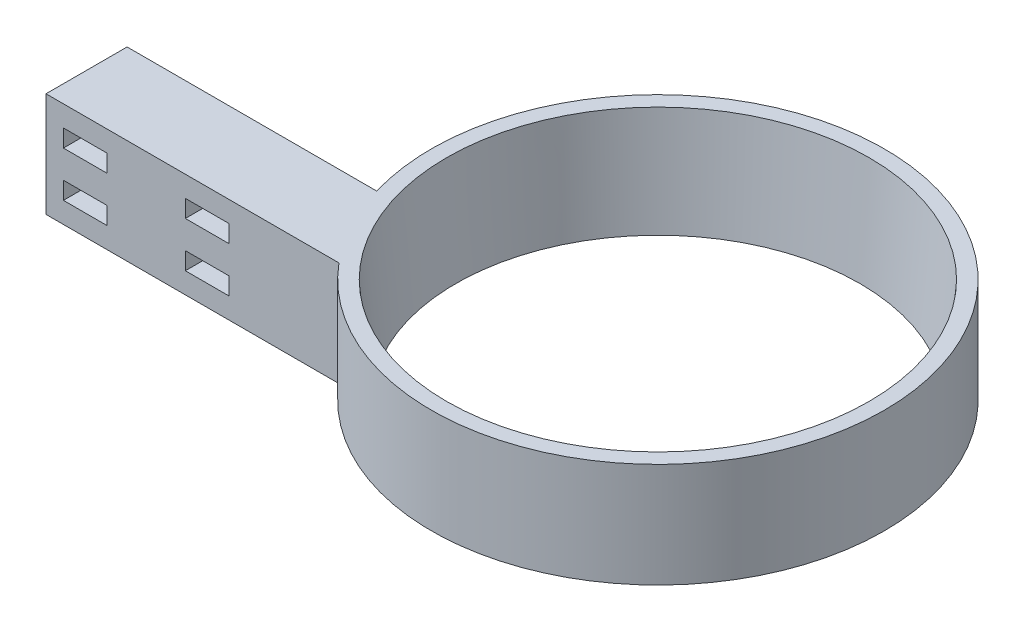
ISO-10303-21;
HEADER;
FILE_DESCRIPTION(('STEP AP214'),'2;1');
FILE_NAME('part.step','',(''),(''),'','','');
FILE_SCHEMA(('AUTOMOTIVE_DESIGN { 1 0 10303 214 1 1 1 1 }'));
ENDSEC;
DATA;
#1=APPLICATION_CONTEXT('core data for automotive mechanical design processes');
#2=APPLICATION_PROTOCOL_DEFINITION('international standard','automotive_design',2000,#1);
#3=PRODUCT_CONTEXT('',#1,'mechanical');
#4=PRODUCT('Part','Part','',(#3));
#5=PRODUCT_RELATED_PRODUCT_CATEGORY('part','',(#4));
#6=PRODUCT_DEFINITION_FORMATION('','',#4);
#7=PRODUCT_DEFINITION_CONTEXT('part definition',#1,'design');
#8=PRODUCT_DEFINITION('design','',#6,#7);
#9=PRODUCT_DEFINITION_SHAPE('','',#8);
#10=(LENGTH_UNIT() NAMED_UNIT(*) SI_UNIT(.MILLI.,.METRE.));
#11=(NAMED_UNIT(*) PLANE_ANGLE_UNIT() SI_UNIT($,.RADIAN.));
#12=(NAMED_UNIT(*) SI_UNIT($,.STERADIAN.) SOLID_ANGLE_UNIT());
#13=UNCERTAINTY_MEASURE_WITH_UNIT(LENGTH_MEASURE(1.E-05),#10,'distance_accuracy_value','');
#14=(GEOMETRIC_REPRESENTATION_CONTEXT(3) GLOBAL_UNCERTAINTY_ASSIGNED_CONTEXT((#13)) GLOBAL_UNIT_ASSIGNED_CONTEXT((#10,
#11,#12)) REPRESENTATION_CONTEXT('',''));
#15=CARTESIAN_POINT('',(0.,0.,0.));
#16=DIRECTION('',(0.,0.,1.));
#17=DIRECTION('',(1.,0.,0.));
#18=AXIS2_PLACEMENT_3D('',#15,#16,#17);
#19=CARTESIAN_POINT('',(-31.6935007697162,3.175,26.4414));
#20=DIRECTION('',(0.,0.,1.));
#21=DIRECTION('',(1.,0.,0.));
#22=AXIS2_PLACEMENT_3D('',#19,#20,#21);
#23=PLANE('',#22);
#24=DIRECTION('',(0.,1.,0.));
#25=VECTOR('',#24,1.);
#26=CARTESIAN_POINT('',(-51.7525,15.24,26.4414));
#27=LINE('',#26,#25);
#28=CARTESIAN_POINT('',(-51.7525,12.065,26.4414));
#29=VERTEX_POINT('',#28);
#30=CARTESIAN_POINT('',(-51.7525,15.24,26.4414));
#31=VERTEX_POINT('',#30);
#32=EDGE_CURVE('E252',#29,#31,#27,.T.);
#33=ORIENTED_EDGE('',*,*,#32,.F.);
#34=DIRECTION('',(1.,0.,0.));
#35=VECTOR('',#34,1.);
#36=CARTESIAN_POINT('',(-59.69,12.065,26.4414));
#37=LINE('',#36,#35);
#38=CARTESIAN_POINT('',(-59.69,12.065,26.4414));
#39=VERTEX_POINT('',#38);
#40=EDGE_CURVE('E260',#39,#29,#37,.T.);
#41=ORIENTED_EDGE('',*,*,#40,.F.);
#42=DIRECTION('',(0.,-1.,0.));
#43=VECTOR('',#42,1.);
#44=CARTESIAN_POINT('',(-59.69,15.24,26.4414));
#45=LINE('',#44,#43);
#46=CARTESIAN_POINT('',(-59.69,15.24,26.4414));
#47=VERTEX_POINT('',#46);
#48=EDGE_CURVE('E257',#47,#39,#45,.T.);
#49=ORIENTED_EDGE('',*,*,#48,.F.);
#50=DIRECTION('',(-1.,0.,0.));
#51=VECTOR('',#50,1.);
#52=CARTESIAN_POINT('',(-59.69,15.24,26.4414));
#53=LINE('',#52,#51);
#54=EDGE_CURVE('E254',#31,#47,#53,.T.);
#55=ORIENTED_EDGE('',*,*,#54,.F.);
#56=EDGE_LOOP('',(#33,#41,#49,#55));
#57=FACE_BOUND('',#56,.T.);
#58=DIRECTION('',(0.,1.,0.));
#59=VECTOR('',#58,1.);
#60=CARTESIAN_POINT('',(-73.9775,15.24,26.4414));
#61=LINE('',#60,#59);
#62=CARTESIAN_POINT('',(-73.9775,12.065,26.4414));
#63=VERTEX_POINT('',#62);
#64=CARTESIAN_POINT('',(-73.9775,15.24,26.4414));
#65=VERTEX_POINT('',#64);
#66=EDGE_CURVE('E284',#63,#65,#61,.T.);
#67=ORIENTED_EDGE('',*,*,#66,.F.);
#68=DIRECTION('',(1.,0.,0.));
#69=VECTOR('',#68,1.);
#70=CARTESIAN_POINT('',(-81.915,12.065,26.4414));
#71=LINE('',#70,#69);
#72=CARTESIAN_POINT('',(-81.915,12.065,26.4414));
#73=VERTEX_POINT('',#72);
#74=EDGE_CURVE('E292',#73,#63,#71,.T.);
#75=ORIENTED_EDGE('',*,*,#74,.F.);
#76=DIRECTION('',(0.,-1.,0.));
#77=VECTOR('',#76,1.);
#78=CARTESIAN_POINT('',(-81.915,15.24,26.4414));
#79=LINE('',#78,#77);
#80=CARTESIAN_POINT('',(-81.915,15.24,26.4414));
#81=VERTEX_POINT('',#80);
#82=EDGE_CURVE('E289',#81,#73,#79,.T.);
#83=ORIENTED_EDGE('',*,*,#82,.F.);
#84=DIRECTION('',(-1.,0.,0.));
#85=VECTOR('',#84,1.);
#86=CARTESIAN_POINT('',(-81.915,15.24,26.4414));
#87=LINE('',#86,#85);
#88=EDGE_CURVE('E286',#65,#81,#87,.T.);
#89=ORIENTED_EDGE('',*,*,#88,.F.);
#90=EDGE_LOOP('',(#67,#75,#83,#89));
#91=FACE_BOUND('',#90,.T.);
#92=DIRECTION('',(-1.,0.,0.));
#93=VECTOR('',#92,1.);
#94=CARTESIAN_POINT('',(-31.6935007697162,0.,26.4414));
#95=LINE('',#94,#93);
#96=CARTESIAN_POINT('',(-31.6935007697162,0.,26.4414));
#97=VERTEX_POINT('',#96);
#98=CARTESIAN_POINT('',(-85.09,0.,26.4414));
#99=VERTEX_POINT('',#98);
#100=EDGE_CURVE('E328',#97,#99,#95,.T.);
#101=ORIENTED_EDGE('',*,*,#100,.F.);
#102=DIRECTION('',(0.,-1.,0.));
#103=VECTOR('',#102,1.);
#104=CARTESIAN_POINT('',(-31.6935007697162,3.175,26.4414));
#105=LINE('',#104,#103);
#106=CARTESIAN_POINT('',(-31.6935007697162,19.05,26.4414));
#107=VERTEX_POINT('',#106);
#108=EDGE_CURVE('E334',#107,#97,#105,.T.);
#109=ORIENTED_EDGE('',*,*,#108,.F.);
#110=DIRECTION('',(-1.,0.,0.));
#111=VECTOR('',#110,1.);
#112=CARTESIAN_POINT('',(-85.09,19.05,26.4414));
#113=LINE('',#112,#111);
#114=CARTESIAN_POINT('',(-85.09,19.05,26.4414));
#115=VERTEX_POINT('',#114);
#116=EDGE_CURVE('E316',#107,#115,#113,.T.);
#117=ORIENTED_EDGE('',*,*,#116,.T.);
#118=DIRECTION('',(0.,-1.,0.));
#119=VECTOR('',#118,1.);
#120=CARTESIAN_POINT('',(-85.09,3.175,26.4414));
#121=LINE('',#120,#119);
#122=EDGE_CURVE('E332',#115,#99,#121,.T.);
#123=ORIENTED_EDGE('',*,*,#122,.T.);
#124=EDGE_LOOP('',(#101,#109,#117,#123));
#125=FACE_BOUND('',#124,.T.);
#126=DIRECTION('',(1.,0.,0.));
#127=VECTOR('',#126,1.);
#128=CARTESIAN_POINT('',(-59.69,6.985,26.4414));
#129=LINE('',#128,#127);
#130=CARTESIAN_POINT('',(-59.69,6.985,26.4414));
#131=VERTEX_POINT('',#130);
#132=CARTESIAN_POINT('',(-51.7525,6.985,26.4414));
#133=VERTEX_POINT('',#132);
#134=EDGE_CURVE('E224',#131,#133,#129,.T.);
#135=ORIENTED_EDGE('',*,*,#134,.T.);
#136=DIRECTION('',(0.,-1.,0.));
#137=VECTOR('',#136,1.);
#138=CARTESIAN_POINT('',(-51.7525,3.81,26.4414));
#139=LINE('',#138,#137);
#140=CARTESIAN_POINT('',(-51.7525,3.81,26.4414));
#141=VERTEX_POINT('',#140);
#142=EDGE_CURVE('E62',#133,#141,#139,.T.);
#143=ORIENTED_EDGE('',*,*,#142,.T.);
#144=DIRECTION('',(-1.,0.,0.));
#145=VECTOR('',#144,1.);
#146=CARTESIAN_POINT('',(-59.69,3.81,26.4414));
#147=LINE('',#146,#145);
#148=CARTESIAN_POINT('',(-59.69,3.81,26.4414));
#149=VERTEX_POINT('',#148);
#150=EDGE_CURVE('E230',#141,#149,#147,.T.);
#151=ORIENTED_EDGE('',*,*,#150,.T.);
#152=DIRECTION('',(0.,1.,0.));
#153=VECTOR('',#152,1.);
#154=CARTESIAN_POINT('',(-59.69,3.81,26.4414));
#155=LINE('',#154,#153);
#156=EDGE_CURVE('E227',#149,#131,#155,.T.);
#157=ORIENTED_EDGE('',*,*,#156,.T.);
#158=EDGE_LOOP('',(#135,#143,#151,#157));
#159=FACE_BOUND('',#158,.T.);
#160=DIRECTION('',(1.,0.,0.));
#161=VECTOR('',#160,1.);
#162=CARTESIAN_POINT('',(-81.915,6.985,26.4414));
#163=LINE('',#162,#161);
#164=CARTESIAN_POINT('',(-81.915,6.985,26.4414));
#165=VERTEX_POINT('',#164);
#166=CARTESIAN_POINT('',(-73.9775,6.985,26.4414));
#167=VERTEX_POINT('',#166);
#168=EDGE_CURVE('E199',#165,#167,#163,.T.);
#169=ORIENTED_EDGE('',*,*,#168,.T.);
#170=DIRECTION('',(0.,-1.,0.));
#171=VECTOR('',#170,1.);
#172=CARTESIAN_POINT('',(-73.9775,3.81,26.4414));
#173=LINE('',#172,#171);
#174=CARTESIAN_POINT('',(-73.9775,3.81,26.4414));
#175=VERTEX_POINT('',#174);
#176=EDGE_CURVE('E54',#167,#175,#173,.T.);
#177=ORIENTED_EDGE('',*,*,#176,.T.);
#178=DIRECTION('',(-1.,0.,0.));
#179=VECTOR('',#178,1.);
#180=CARTESIAN_POINT('',(-81.915,3.81,26.4414));
#181=LINE('',#180,#179);
#182=CARTESIAN_POINT('',(-81.915,3.81,26.4414));
#183=VERTEX_POINT('',#182);
#184=EDGE_CURVE('E184',#175,#183,#181,.T.);
#185=ORIENTED_EDGE('',*,*,#184,.T.);
#186=DIRECTION('',(0.,1.,0.));
#187=VECTOR('',#186,1.);
#188=CARTESIAN_POINT('',(-81.915,3.81,26.4414));
#189=LINE('',#188,#187);
#190=EDGE_CURVE('E206',#183,#165,#189,.T.);
#191=ORIENTED_EDGE('',*,*,#190,.T.);
#192=EDGE_LOOP('',(#169,#177,#185,#191));
#193=FACE_BOUND('',#192,.T.);
#194=ADVANCED_FACE('F39',(#57,#91,#125,#159,#193),#23,.T.);
#195=CARTESIAN_POINT('',(-85.09,3.175,11.6586));
#196=DIRECTION('',(0.,0.,-1.));
#197=DIRECTION('',(-1.,0.,0.));
#198=AXIS2_PLACEMENT_3D('',#195,#196,#197);
#199=PLANE('',#198);
#200=DIRECTION('',(0.,1.,0.));
#201=VECTOR('',#200,1.);
#202=CARTESIAN_POINT('',(-51.7525,15.24,11.6586));
#203=LINE('',#202,#201);
#204=CARTESIAN_POINT('',(-51.7525,12.065,11.6586));
#205=VERTEX_POINT('',#204);
#206=CARTESIAN_POINT('',(-51.7525,15.24,11.6586));
#207=VERTEX_POINT('',#206);
#208=EDGE_CURVE('E249',#205,#207,#203,.T.);
#209=ORIENTED_EDGE('',*,*,#208,.T.);
#210=DIRECTION('',(-1.,0.,0.));
#211=VECTOR('',#210,1.);
#212=CARTESIAN_POINT('',(-59.69,15.24,11.6586));
#213=LINE('',#212,#211);
#214=CARTESIAN_POINT('',(-59.69,15.24,11.6586));
#215=VERTEX_POINT('',#214);
#216=EDGE_CURVE('E266',#207,#215,#213,.T.);
#217=ORIENTED_EDGE('',*,*,#216,.T.);
#218=DIRECTION('',(0.,-1.,0.));
#219=VECTOR('',#218,1.);
#220=CARTESIAN_POINT('',(-59.69,15.24,11.6586));
#221=LINE('',#220,#219);
#222=CARTESIAN_POINT('',(-59.69,12.065,11.6586));
#223=VERTEX_POINT('',#222);
#224=EDGE_CURVE('E192',#215,#223,#221,.T.);
#225=ORIENTED_EDGE('',*,*,#224,.T.);
#226=DIRECTION('',(1.,0.,0.));
#227=VECTOR('',#226,1.);
#228=CARTESIAN_POINT('',(-59.69,12.065,11.6586));
#229=LINE('',#228,#227);
#230=EDGE_CURVE('E246',#223,#205,#229,.T.);
#231=ORIENTED_EDGE('',*,*,#230,.T.);
#232=EDGE_LOOP('',(#209,#217,#225,#231));
#233=FACE_BOUND('',#232,.T.);
#234=DIRECTION('',(0.,1.,0.));
#235=VECTOR('',#234,1.);
#236=CARTESIAN_POINT('',(-73.9775,15.24,11.6586));
#237=LINE('',#236,#235);
#238=CARTESIAN_POINT('',(-73.9775,12.065,11.6586));
#239=VERTEX_POINT('',#238);
#240=CARTESIAN_POINT('',(-73.9775,15.24,11.6586));
#241=VERTEX_POINT('',#240);
#242=EDGE_CURVE('E281',#239,#241,#237,.T.);
#243=ORIENTED_EDGE('',*,*,#242,.T.);
#244=DIRECTION('',(-1.,0.,0.));
#245=VECTOR('',#244,1.);
#246=CARTESIAN_POINT('',(-81.915,15.24,11.6586));
#247=LINE('',#246,#245);
#248=CARTESIAN_POINT('',(-81.915,15.24,11.6586));
#249=VERTEX_POINT('',#248);
#250=EDGE_CURVE('E298',#241,#249,#247,.T.);
#251=ORIENTED_EDGE('',*,*,#250,.T.);
#252=DIRECTION('',(0.,-1.,0.));
#253=VECTOR('',#252,1.);
#254=CARTESIAN_POINT('',(-81.915,15.24,11.6586));
#255=LINE('',#254,#253);
#256=CARTESIAN_POINT('',(-81.915,12.065,11.6586));
#257=VERTEX_POINT('',#256);
#258=EDGE_CURVE('E275',#249,#257,#255,.T.);
#259=ORIENTED_EDGE('',*,*,#258,.T.);
#260=DIRECTION('',(1.,0.,0.));
#261=VECTOR('',#260,1.);
#262=CARTESIAN_POINT('',(-81.915,12.065,11.6586));
#263=LINE('',#262,#261);
#264=EDGE_CURVE('E278',#257,#239,#263,.T.);
#265=ORIENTED_EDGE('',*,*,#264,.T.);
#266=EDGE_LOOP('',(#243,#251,#259,#265));
#267=FACE_BOUND('',#266,.T.);
#268=DIRECTION('',(1.,0.,0.));
#269=VECTOR('',#268,1.);
#270=CARTESIAN_POINT('',(-85.09,0.,11.6586));
#271=LINE('',#270,#269);
#272=CARTESIAN_POINT('',(-85.09,0.,11.6586));
#273=VERTEX_POINT('',#272);
#274=CARTESIAN_POINT('',(-39.5942252233833,0.,11.6586));
#275=VERTEX_POINT('',#274);
#276=EDGE_CURVE('E325',#273,#275,#271,.T.);
#277=ORIENTED_EDGE('',*,*,#276,.F.);
#278=DIRECTION('',(0.,-1.,0.));
#279=VECTOR('',#278,1.);
#280=CARTESIAN_POINT('',(-85.09,3.175,11.6586));
#281=LINE('',#280,#279);
#282=CARTESIAN_POINT('',(-85.09,19.05,11.6586));
#283=VERTEX_POINT('',#282);
#284=EDGE_CURVE('E331',#283,#273,#281,.T.);
#285=ORIENTED_EDGE('',*,*,#284,.F.);
#286=DIRECTION('',(1.,0.,0.));
#287=VECTOR('',#286,1.);
#288=CARTESIAN_POINT('',(-85.09,19.05,11.6586));
#289=LINE('',#288,#287);
#290=CARTESIAN_POINT('',(-39.5942252233833,19.05,11.6586));
#291=VERTEX_POINT('',#290);
#292=EDGE_CURVE('E313',#283,#291,#289,.T.);
#293=ORIENTED_EDGE('',*,*,#292,.T.);
#294=DIRECTION('',(0.,-1.,0.));
#295=VECTOR('',#294,1.);
#296=CARTESIAN_POINT('',(-39.5942252233833,3.175,11.6586));
#297=LINE('',#296,#295);
#298=EDGE_CURVE('E337',#291,#275,#297,.T.);
#299=ORIENTED_EDGE('',*,*,#298,.T.);
#300=EDGE_LOOP('',(#277,#285,#293,#299));
#301=FACE_BOUND('',#300,.T.);
#302=DIRECTION('',(-1.,0.,0.));
#303=VECTOR('',#302,1.);
#304=CARTESIAN_POINT('',(-59.69,3.81,11.6586));
#305=LINE('',#304,#303);
#306=CARTESIAN_POINT('',(-51.7525,3.81,11.6586));
#307=VERTEX_POINT('',#306);
#308=CARTESIAN_POINT('',(-59.69,3.81,11.6586));
#309=VERTEX_POINT('',#308);
#310=EDGE_CURVE('E217',#307,#309,#305,.T.);
#311=ORIENTED_EDGE('',*,*,#310,.F.);
#312=DIRECTION('',(0.,-1.,0.));
#313=VECTOR('',#312,1.);
#314=CARTESIAN_POINT('',(-51.7525,3.81,11.6586));
#315=LINE('',#314,#313);
#316=CARTESIAN_POINT('',(-51.7525,6.985,11.6586));
#317=VERTEX_POINT('',#316);
#318=EDGE_CURVE('E220',#317,#307,#315,.T.);
#319=ORIENTED_EDGE('',*,*,#318,.F.);
#320=DIRECTION('',(1.,0.,0.));
#321=VECTOR('',#320,1.);
#322=CARTESIAN_POINT('',(-59.69,6.985,11.6586));
#323=LINE('',#322,#321);
#324=CARTESIAN_POINT('',(-59.69,6.985,11.6586));
#325=VERTEX_POINT('',#324);
#326=EDGE_CURVE('E236',#325,#317,#323,.T.);
#327=ORIENTED_EDGE('',*,*,#326,.F.);
#328=DIRECTION('',(0.,1.,0.));
#329=VECTOR('',#328,1.);
#330=CARTESIAN_POINT('',(-59.69,3.81,11.6586));
#331=LINE('',#330,#329);
#332=EDGE_CURVE('E215',#309,#325,#331,.T.);
#333=ORIENTED_EDGE('',*,*,#332,.F.);
#334=EDGE_LOOP('',(#311,#319,#327,#333));
#335=FACE_BOUND('',#334,.T.);
#336=DIRECTION('',(-1.,0.,0.));
#337=VECTOR('',#336,1.);
#338=CARTESIAN_POINT('',(-81.915,3.81,11.6586));
#339=LINE('',#338,#337);
#340=CARTESIAN_POINT('',(-73.9775,3.81,11.6586));
#341=VERTEX_POINT('',#340);
#342=CARTESIAN_POINT('',(-81.915,3.81,11.6586));
#343=VERTEX_POINT('',#342);
#344=EDGE_CURVE('E197',#341,#343,#339,.T.);
#345=ORIENTED_EDGE('',*,*,#344,.F.);
#346=DIRECTION('',(0.,-1.,0.));
#347=VECTOR('',#346,1.);
#348=CARTESIAN_POINT('',(-73.9775,3.81,11.6586));
#349=LINE('',#348,#347);
#350=CARTESIAN_POINT('',(-73.9775,6.985,11.6586));
#351=VERTEX_POINT('',#350);
#352=EDGE_CURVE('E178',#351,#341,#349,.T.);
#353=ORIENTED_EDGE('',*,*,#352,.F.);
#354=DIRECTION('',(1.,0.,0.));
#355=VECTOR('',#354,1.);
#356=CARTESIAN_POINT('',(-81.915,6.985,11.6586));
#357=LINE('',#356,#355);
#358=CARTESIAN_POINT('',(-81.915,6.985,11.6586));
#359=VERTEX_POINT('',#358);
#360=EDGE_CURVE('E188',#359,#351,#357,.T.);
#361=ORIENTED_EDGE('',*,*,#360,.F.);
#362=DIRECTION('',(0.,1.,0.));
#363=VECTOR('',#362,1.);
#364=CARTESIAN_POINT('',(-81.915,3.81,11.6586));
#365=LINE('',#364,#363);
#366=EDGE_CURVE('E201',#343,#359,#365,.T.);
#367=ORIENTED_EDGE('',*,*,#366,.F.);
#368=EDGE_LOOP('',(#345,#353,#361,#367));
#369=FACE_BOUND('',#368,.T.);
#370=ADVANCED_FACE('F195',(#233,#267,#301,#335,#369),#199,.T.);
#371=CARTESIAN_POINT('',(0.,19.05,0.));
#372=DIRECTION('',(0.,-1.,0.));
#373=DIRECTION('',(0.,0.,-1.));
#374=AXIS2_PLACEMENT_3D('',#371,#372,#373);
#375=CYLINDRICAL_SURFACE('',#374,41.275);
#376=ORIENTED_EDGE('',*,*,#298,.F.);
#377=CARTESIAN_POINT('',(0.,19.05,0.));
#378=DIRECTION('',(0.,1.,0.));
#379=DIRECTION('',(0.,0.,1.));
#380=AXIS2_PLACEMENT_3D('',#377,#378,#379);
#381=CIRCLE('',#380,41.275);
#382=EDGE_CURVE('E11',#107,#291,#381,.T.);
#383=ORIENTED_EDGE('',*,*,#382,.F.);
#384=ORIENTED_EDGE('',*,*,#108,.T.);
#385=CARTESIAN_POINT('',(0.,0.,0.));
#386=DIRECTION('',(0.,1.,0.));
#387=DIRECTION('',(0.,0.,1.));
#388=AXIS2_PLACEMENT_3D('',#385,#386,#387);
#389=CIRCLE('',#388,41.275);
#390=EDGE_CURVE('E43',#97,#275,#389,.T.);
#391=ORIENTED_EDGE('',*,*,#390,.T.);
#392=EDGE_LOOP('',(#376,#383,#384,#391));
#393=FACE_BOUND('',#392,.T.);
#394=ADVANCED_FACE('F41',(#393),#375,.T.);
#395=CARTESIAN_POINT('',(0.,19.05,0.));
#396=DIRECTION('',(0.,1.,0.));
#397=DIRECTION('',(0.,0.,1.));
#398=AXIS2_PLACEMENT_3D('',#395,#396,#397);
#399=PLANE('',#398);
#400=CARTESIAN_POINT('',(0.,19.05,0.));
#401=DIRECTION('',(0.,-1.,0.));
#402=DIRECTION('',(0.,0.,-1.));
#403=AXIS2_PLACEMENT_3D('',#400,#401,#402);
#404=CIRCLE('',#403,38.4966590401689);
#405=CARTESIAN_POINT('',(0.,19.05,-38.4966590401689));
#406=VERTEX_POINT('',#405);
#407=EDGE_CURVE('E310',#406,#406,#404,.T.);
#408=ORIENTED_EDGE('',*,*,#407,.T.);
#409=EDGE_LOOP('',(#408));
#410=FACE_BOUND('',#409,.T.);
#411=ORIENTED_EDGE('',*,*,#382,.T.);
#412=ORIENTED_EDGE('',*,*,#292,.F.);
#413=DIRECTION('',(0.,0.,1.));
#414=VECTOR('',#413,1.);
#415=CARTESIAN_POINT('',(-85.09,19.05,23.2664));
#416=LINE('',#415,#414);
#417=EDGE_CURVE('E319',#283,#115,#416,.T.);
#418=ORIENTED_EDGE('',*,*,#417,.T.);
#419=ORIENTED_EDGE('',*,*,#116,.F.);
#420=EDGE_LOOP('',(#411,#412,#418,#419));
#421=FACE_BOUND('',#420,.T.);
#422=ADVANCED_FACE('F355',(#410,#421),#399,.T.);
#423=CARTESIAN_POINT('',(0.,0.,0.));
#424=DIRECTION('',(0.,1.,0.));
#425=DIRECTION('',(0.,0.,1.));
#426=AXIS2_PLACEMENT_3D('',#423,#424,#425);
#427=PLANE('',#426);
#428=CARTESIAN_POINT('',(0.,0.,0.));
#429=DIRECTION('',(0.,-1.,0.));
#430=DIRECTION('',(0.,0.,-1.));
#431=AXIS2_PLACEMENT_3D('',#428,#429,#430);
#432=CIRCLE('',#431,36.83);
#433=CARTESIAN_POINT('',(0.,0.,-36.83));
#434=VERTEX_POINT('',#433);
#435=EDGE_CURVE('E307',#434,#434,#432,.T.);
#436=ORIENTED_EDGE('',*,*,#435,.F.);
#437=EDGE_LOOP('',(#436));
#438=FACE_BOUND('',#437,.T.);
#439=ORIENTED_EDGE('',*,*,#390,.F.);
#440=ORIENTED_EDGE('',*,*,#100,.T.);
#441=DIRECTION('',(0.,0.,-1.));
#442=VECTOR('',#441,1.);
#443=CARTESIAN_POINT('',(-85.09,0.,26.4414));
#444=LINE('',#443,#442);
#445=EDGE_CURVE('E322',#99,#273,#444,.T.);
#446=ORIENTED_EDGE('',*,*,#445,.T.);
#447=ORIENTED_EDGE('',*,*,#276,.T.);
#448=EDGE_LOOP('',(#439,#440,#446,#447));
#449=FACE_BOUND('',#448,.T.);
#450=ADVANCED_FACE('F349',(#438,#449),#427,.F.);
#451=CARTESIAN_POINT('',(-85.09,3.175,26.4414));
#452=DIRECTION('',(-1.,0.,0.));
#453=DIRECTION('',(0.,0.,1.));
#454=AXIS2_PLACEMENT_3D('',#451,#452,#453);
#455=PLANE('',#454);
#456=ORIENTED_EDGE('',*,*,#417,.F.);
#457=ORIENTED_EDGE('',*,*,#284,.T.);
#458=ORIENTED_EDGE('',*,*,#445,.F.);
#459=ORIENTED_EDGE('',*,*,#122,.F.);
#460=EDGE_LOOP('',(#456,#457,#458,#459));
#461=FACE_BOUND('',#460,.T.);
#462=ADVANCED_FACE('F344',(#461),#455,.T.);
#463=CARTESIAN_POINT('',(0.,0.,0.));
#464=DIRECTION('',(0.,1.,0.));
#465=DIRECTION('',(0.,0.,-1.));
#466=AXIS2_PLACEMENT_3D('',#463,#464,#465);
#467=CONICAL_SURFACE('',#466,36.83,0.0872664625997167);
#468=ORIENTED_EDGE('',*,*,#407,.F.);
#469=EDGE_LOOP('',(#468));
#470=FACE_BOUND('',#469,.T.);
#471=ORIENTED_EDGE('',*,*,#435,.T.);
#472=EDGE_LOOP('',(#471));
#473=FACE_BOUND('',#472,.T.);
#474=ADVANCED_FACE('F377',(#470,#473),#467,.F.);
#475=CARTESIAN_POINT('',(-73.9775,15.24,-41.276));
#476=DIRECTION('',(1.,0.,0.));
#477=DIRECTION('',(0.,0.,-1.));
#478=AXIS2_PLACEMENT_3D('',#475,#476,#477);
#479=PLANE('',#478);
#480=DIRECTION('',(0.,0.,1.));
#481=VECTOR('',#480,1.);
#482=CARTESIAN_POINT('',(-73.9775,12.065,-41.276));
#483=LINE('',#482,#481);
#484=EDGE_CURVE('E296',#239,#63,#483,.T.);
#485=ORIENTED_EDGE('',*,*,#484,.T.);
#486=ORIENTED_EDGE('',*,*,#66,.T.);
#487=DIRECTION('',(0.,0.,1.));
#488=VECTOR('',#487,1.);
#489=CARTESIAN_POINT('',(-73.9775,15.24,-41.276));
#490=LINE('',#489,#488);
#491=EDGE_CURVE('E295',#241,#65,#490,.T.);
#492=ORIENTED_EDGE('',*,*,#491,.F.);
#493=ORIENTED_EDGE('',*,*,#242,.F.);
#494=EDGE_LOOP('',(#485,#486,#492,#493));
#495=FACE_BOUND('',#494,.T.);
#496=ADVANCED_FACE('F387',(#495),#479,.F.);
#497=CARTESIAN_POINT('',(-81.915,12.065,-41.276));
#498=DIRECTION('',(0.,-1.,0.));
#499=DIRECTION('',(0.,0.,-1.));
#500=AXIS2_PLACEMENT_3D('',#497,#498,#499);
#501=PLANE('',#500);
#502=DIRECTION('',(0.,0.,1.));
#503=VECTOR('',#502,1.);
#504=CARTESIAN_POINT('',(-81.915,12.065,-41.276));
#505=LINE('',#504,#503);
#506=EDGE_CURVE('E299',#257,#73,#505,.T.);
#507=ORIENTED_EDGE('',*,*,#506,.T.);
#508=ORIENTED_EDGE('',*,*,#74,.T.);
#509=ORIENTED_EDGE('',*,*,#484,.F.);
#510=ORIENTED_EDGE('',*,*,#264,.F.);
#511=EDGE_LOOP('',(#507,#508,#509,#510));
#512=FACE_BOUND('',#511,.T.);
#513=ADVANCED_FACE('F392',(#512),#501,.F.);
#514=CARTESIAN_POINT('',(-81.915,15.24,-41.276));
#515=DIRECTION('',(-1.,0.,0.));
#516=DIRECTION('',(0.,0.,1.));
#517=AXIS2_PLACEMENT_3D('',#514,#515,#516);
#518=PLANE('',#517);
#519=DIRECTION('',(0.,0.,1.));
#520=VECTOR('',#519,1.);
#521=CARTESIAN_POINT('',(-81.915,15.24,-41.276));
#522=LINE('',#521,#520);
#523=EDGE_CURVE('E301',#249,#81,#522,.T.);
#524=ORIENTED_EDGE('',*,*,#523,.T.);
#525=ORIENTED_EDGE('',*,*,#82,.T.);
#526=ORIENTED_EDGE('',*,*,#506,.F.);
#527=ORIENTED_EDGE('',*,*,#258,.F.);
#528=EDGE_LOOP('',(#524,#525,#526,#527));
#529=FACE_BOUND('',#528,.T.);
#530=ADVANCED_FACE('F398',(#529),#518,.F.);
#531=CARTESIAN_POINT('',(-81.915,15.24,-41.276));
#532=DIRECTION('',(0.,1.,0.));
#533=DIRECTION('',(-1.,0.,0.));
#534=AXIS2_PLACEMENT_3D('',#531,#532,#533);
#535=PLANE('',#534);
#536=ORIENTED_EDGE('',*,*,#491,.T.);
#537=ORIENTED_EDGE('',*,*,#88,.T.);
#538=ORIENTED_EDGE('',*,*,#523,.F.);
#539=ORIENTED_EDGE('',*,*,#250,.F.);
#540=EDGE_LOOP('',(#536,#537,#538,#539));
#541=FACE_BOUND('',#540,.T.);
#542=ADVANCED_FACE('F402',(#541),#535,.F.);
#543=CARTESIAN_POINT('',(-51.7525,15.24,-41.276));
#544=DIRECTION('',(1.,0.,0.));
#545=DIRECTION('',(0.,0.,-1.));
#546=AXIS2_PLACEMENT_3D('',#543,#544,#545);
#547=PLANE('',#546);
#548=DIRECTION('',(0.,0.,1.));
#549=VECTOR('',#548,1.);
#550=CARTESIAN_POINT('',(-51.7525,12.065,-41.276));
#551=LINE('',#550,#549);
#552=EDGE_CURVE('E264',#205,#29,#551,.T.);
#553=ORIENTED_EDGE('',*,*,#552,.T.);
#554=ORIENTED_EDGE('',*,*,#32,.T.);
#555=DIRECTION('',(0.,0.,1.));
#556=VECTOR('',#555,1.);
#557=CARTESIAN_POINT('',(-51.7525,15.24,-41.276));
#558=LINE('',#557,#556);
#559=EDGE_CURVE('E263',#207,#31,#558,.T.);
#560=ORIENTED_EDGE('',*,*,#559,.F.);
#561=ORIENTED_EDGE('',*,*,#208,.F.);
#562=EDGE_LOOP('',(#553,#554,#560,#561));
#563=FACE_BOUND('',#562,.T.);
#564=ADVANCED_FACE('F405',(#563),#547,.F.);
#565=CARTESIAN_POINT('',(-59.69,12.065,-41.276));
#566=DIRECTION('',(0.,-1.,0.));
#567=DIRECTION('',(0.,0.,-1.));
#568=AXIS2_PLACEMENT_3D('',#565,#566,#567);
#569=PLANE('',#568);
#570=DIRECTION('',(0.,0.,1.));
#571=VECTOR('',#570,1.);
#572=CARTESIAN_POINT('',(-59.69,12.065,-41.276));
#573=LINE('',#572,#571);
#574=EDGE_CURVE('E267',#223,#39,#573,.T.);
#575=ORIENTED_EDGE('',*,*,#574,.T.);
#576=ORIENTED_EDGE('',*,*,#40,.T.);
#577=ORIENTED_EDGE('',*,*,#552,.F.);
#578=ORIENTED_EDGE('',*,*,#230,.F.);
#579=EDGE_LOOP('',(#575,#576,#577,#578));
#580=FACE_BOUND('',#579,.T.);
#581=ADVANCED_FACE('F412',(#580),#569,.F.);
#582=CARTESIAN_POINT('',(-59.69,15.24,-41.276));
#583=DIRECTION('',(-1.,0.,0.));
#584=DIRECTION('',(0.,0.,1.));
#585=AXIS2_PLACEMENT_3D('',#582,#583,#584);
#586=PLANE('',#585);
#587=DIRECTION('',(0.,0.,1.));
#588=VECTOR('',#587,1.);
#589=CARTESIAN_POINT('',(-59.69,15.24,-41.276));
#590=LINE('',#589,#588);
#591=EDGE_CURVE('E269',#215,#47,#590,.T.);
#592=ORIENTED_EDGE('',*,*,#591,.T.);
#593=ORIENTED_EDGE('',*,*,#48,.T.);
#594=ORIENTED_EDGE('',*,*,#574,.F.);
#595=ORIENTED_EDGE('',*,*,#224,.F.);
#596=EDGE_LOOP('',(#592,#593,#594,#595));
#597=FACE_BOUND('',#596,.T.);
#598=ADVANCED_FACE('F417',(#597),#586,.F.);
#599=CARTESIAN_POINT('',(-59.69,15.24,-41.276));
#600=DIRECTION('',(0.,1.,0.));
#601=DIRECTION('',(-1.,0.,0.));
#602=AXIS2_PLACEMENT_3D('',#599,#600,#601);
#603=PLANE('',#602);
#604=ORIENTED_EDGE('',*,*,#559,.T.);
#605=ORIENTED_EDGE('',*,*,#54,.T.);
#606=ORIENTED_EDGE('',*,*,#591,.F.);
#607=ORIENTED_EDGE('',*,*,#216,.F.);
#608=EDGE_LOOP('',(#604,#605,#606,#607));
#609=FACE_BOUND('',#608,.T.);
#610=ADVANCED_FACE('F414',(#609),#603,.F.);
#611=CARTESIAN_POINT('',(-51.7525,3.81,-41.276));
#612=DIRECTION('',(-1.,0.,0.));
#613=DIRECTION('',(0.,0.,1.));
#614=AXIS2_PLACEMENT_3D('',#611,#612,#613);
#615=PLANE('',#614);
#616=ORIENTED_EDGE('',*,*,#318,.T.);
#617=DIRECTION('',(0.,0.,1.));
#618=VECTOR('',#617,1.);
#619=CARTESIAN_POINT('',(-51.7525,3.81,-41.276));
#620=LINE('',#619,#618);
#621=EDGE_CURVE('E234',#307,#141,#620,.T.);
#622=ORIENTED_EDGE('',*,*,#621,.T.);
#623=ORIENTED_EDGE('',*,*,#142,.F.);
#624=DIRECTION('',(0.,0.,1.));
#625=VECTOR('',#624,1.);
#626=CARTESIAN_POINT('',(-51.7525,6.985,-41.276));
#627=LINE('',#626,#625);
#628=EDGE_CURVE('E233',#317,#133,#627,.T.);
#629=ORIENTED_EDGE('',*,*,#628,.F.);
#630=EDGE_LOOP('',(#616,#622,#623,#629));
#631=FACE_BOUND('',#630,.T.);
#632=ADVANCED_FACE('F416',(#631),#615,.T.);
#633=CARTESIAN_POINT('',(-59.69,3.81,-41.276));
#634=DIRECTION('',(0.,1.,0.));
#635=DIRECTION('',(-1.,0.,0.));
#636=AXIS2_PLACEMENT_3D('',#633,#634,#635);
#637=PLANE('',#636);
#638=ORIENTED_EDGE('',*,*,#310,.T.);
#639=DIRECTION('',(0.,0.,1.));
#640=VECTOR('',#639,1.);
#641=CARTESIAN_POINT('',(-59.69,3.81,-41.276));
#642=LINE('',#641,#640);
#643=EDGE_CURVE('E237',#309,#149,#642,.T.);
#644=ORIENTED_EDGE('',*,*,#643,.T.);
#645=ORIENTED_EDGE('',*,*,#150,.F.);
#646=ORIENTED_EDGE('',*,*,#621,.F.);
#647=EDGE_LOOP('',(#638,#644,#645,#646));
#648=FACE_BOUND('',#647,.T.);
#649=ADVANCED_FACE('F427',(#648),#637,.T.);
#650=CARTESIAN_POINT('',(-59.69,3.81,-41.276));
#651=DIRECTION('',(1.,0.,0.));
#652=DIRECTION('',(0.,0.,-1.));
#653=AXIS2_PLACEMENT_3D('',#650,#651,#652);
#654=PLANE('',#653);
#655=ORIENTED_EDGE('',*,*,#332,.T.);
#656=DIRECTION('',(0.,0.,1.));
#657=VECTOR('',#656,1.);
#658=CARTESIAN_POINT('',(-59.69,6.985,-41.276));
#659=LINE('',#658,#657);
#660=EDGE_CURVE('E239',#325,#131,#659,.T.);
#661=ORIENTED_EDGE('',*,*,#660,.T.);
#662=ORIENTED_EDGE('',*,*,#156,.F.);
#663=ORIENTED_EDGE('',*,*,#643,.F.);
#664=EDGE_LOOP('',(#655,#661,#662,#663));
#665=FACE_BOUND('',#664,.T.);
#666=ADVANCED_FACE('F431',(#665),#654,.T.);
#667=CARTESIAN_POINT('',(-59.69,6.985,-41.276));
#668=DIRECTION('',(0.,-1.,0.));
#669=DIRECTION('',(0.,0.,-1.));
#670=AXIS2_PLACEMENT_3D('',#667,#668,#669);
#671=PLANE('',#670);
#672=ORIENTED_EDGE('',*,*,#326,.T.);
#673=ORIENTED_EDGE('',*,*,#628,.T.);
#674=ORIENTED_EDGE('',*,*,#134,.F.);
#675=ORIENTED_EDGE('',*,*,#660,.F.);
#676=EDGE_LOOP('',(#672,#673,#674,#675));
#677=FACE_BOUND('',#676,.T.);
#678=ADVANCED_FACE('F428',(#677),#671,.T.);
#679=CARTESIAN_POINT('',(-73.9775,3.81,-41.276));
#680=DIRECTION('',(-1.,0.,0.));
#681=DIRECTION('',(0.,0.,1.));
#682=AXIS2_PLACEMENT_3D('',#679,#680,#681);
#683=PLANE('',#682);
#684=ORIENTED_EDGE('',*,*,#352,.T.);
#685=DIRECTION('',(0.,0.,1.));
#686=VECTOR('',#685,1.);
#687=CARTESIAN_POINT('',(-73.9775,3.81,-41.276));
#688=LINE('',#687,#686);
#689=EDGE_CURVE('E193',#341,#175,#688,.T.);
#690=ORIENTED_EDGE('',*,*,#689,.T.);
#691=ORIENTED_EDGE('',*,*,#176,.F.);
#692=DIRECTION('',(0.,0.,1.));
#693=VECTOR('',#692,1.);
#694=CARTESIAN_POINT('',(-73.9775,6.985,-41.276));
#695=LINE('',#694,#693);
#696=EDGE_CURVE('E174',#351,#167,#695,.T.);
#697=ORIENTED_EDGE('',*,*,#696,.F.);
#698=EDGE_LOOP('',(#684,#690,#691,#697));
#699=FACE_BOUND('',#698,.T.);
#700=ADVANCED_FACE('F176',(#699),#683,.T.);
#701=CARTESIAN_POINT('',(-81.915,3.81,-41.276));
#702=DIRECTION('',(0.,1.,0.));
#703=DIRECTION('',(-1.,0.,0.));
#704=AXIS2_PLACEMENT_3D('',#701,#702,#703);
#705=PLANE('',#704);
#706=ORIENTED_EDGE('',*,*,#344,.T.);
#707=DIRECTION('',(0.,0.,1.));
#708=VECTOR('',#707,1.);
#709=CARTESIAN_POINT('',(-81.915,3.81,-41.276));
#710=LINE('',#709,#708);
#711=EDGE_CURVE('E212',#343,#183,#710,.T.);
#712=ORIENTED_EDGE('',*,*,#711,.T.);
#713=ORIENTED_EDGE('',*,*,#184,.F.);
#714=ORIENTED_EDGE('',*,*,#689,.F.);
#715=EDGE_LOOP('',(#706,#712,#713,#714));
#716=FACE_BOUND('',#715,.T.);
#717=ADVANCED_FACE('F441',(#716),#705,.T.);
#718=CARTESIAN_POINT('',(-81.915,3.81,-41.276));
#719=DIRECTION('',(1.,0.,0.));
#720=DIRECTION('',(0.,0.,-1.));
#721=AXIS2_PLACEMENT_3D('',#718,#719,#720);
#722=PLANE('',#721);
#723=ORIENTED_EDGE('',*,*,#366,.T.);
#724=DIRECTION('',(0.,0.,1.));
#725=VECTOR('',#724,1.);
#726=CARTESIAN_POINT('',(-81.915,6.985,-41.276));
#727=LINE('',#726,#725);
#728=EDGE_CURVE('E183',#359,#165,#727,.T.);
#729=ORIENTED_EDGE('',*,*,#728,.T.);
#730=ORIENTED_EDGE('',*,*,#190,.F.);
#731=ORIENTED_EDGE('',*,*,#711,.F.);
#732=EDGE_LOOP('',(#723,#729,#730,#731));
#733=FACE_BOUND('',#732,.T.);
#734=ADVANCED_FACE('F444',(#733),#722,.T.);
#735=CARTESIAN_POINT('',(-81.915,6.985,-41.276));
#736=DIRECTION('',(0.,-1.,0.));
#737=DIRECTION('',(0.,0.,-1.));
#738=AXIS2_PLACEMENT_3D('',#735,#736,#737);
#739=PLANE('',#738);
#740=ORIENTED_EDGE('',*,*,#360,.T.);
#741=ORIENTED_EDGE('',*,*,#696,.T.);
#742=ORIENTED_EDGE('',*,*,#168,.F.);
#743=ORIENTED_EDGE('',*,*,#728,.F.);
#744=EDGE_LOOP('',(#740,#741,#742,#743));
#745=FACE_BOUND('',#744,.T.);
#746=ADVANCED_FACE('F189',(#745),#739,.T.);
#747=CLOSED_SHELL('',(#194,#370,#394,#422,#450,#462,#474,#496,#513,#530,#542,#564,#581,#598,
#610,#632,#649,#666,#678,#700,#717,#734,#746));
#748=MANIFOLD_SOLID_BREP('B2',#747);
#749=ADVANCED_BREP_SHAPE_REPRESENTATION('',(#18,#748),#14);
#750=SHAPE_DEFINITION_REPRESENTATION(#9,#749);
ENDSEC;
END-ISO-10303-21;
